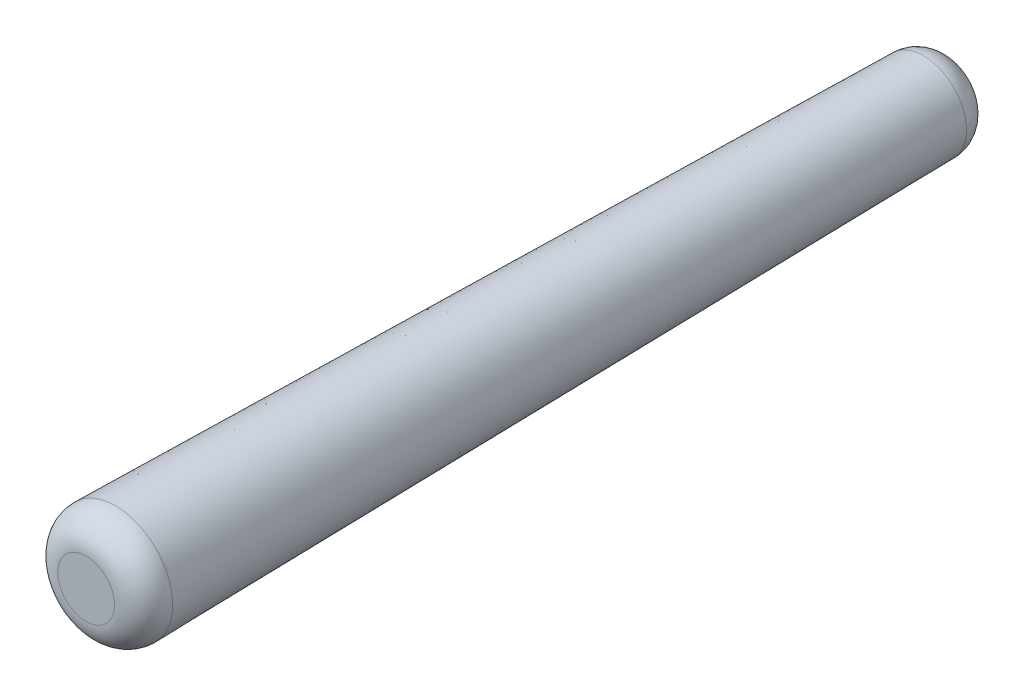
ISO-10303-21;
HEADER;
FILE_DESCRIPTION(('STEP AP214'),'2;1');
FILE_NAME('part.step','',(''),(''),'','','');
FILE_SCHEMA(('AUTOMOTIVE_DESIGN { 1 0 10303 214 1 1 1 1 }'));
ENDSEC;
DATA;
#1=APPLICATION_CONTEXT('core data for automotive mechanical design processes');
#2=APPLICATION_PROTOCOL_DEFINITION('international standard','automotive_design',2000,#1);
#3=PRODUCT_CONTEXT('',#1,'mechanical');
#4=PRODUCT('Part','Part','',(#3));
#5=PRODUCT_RELATED_PRODUCT_CATEGORY('part','',(#4));
#6=PRODUCT_DEFINITION_FORMATION('','',#4);
#7=PRODUCT_DEFINITION_CONTEXT('part definition',#1,'design');
#8=PRODUCT_DEFINITION('design','',#6,#7);
#9=PRODUCT_DEFINITION_SHAPE('','',#8);
#10=(LENGTH_UNIT() NAMED_UNIT(*) SI_UNIT(.MILLI.,.METRE.));
#11=(NAMED_UNIT(*) PLANE_ANGLE_UNIT() SI_UNIT($,.RADIAN.));
#12=(NAMED_UNIT(*) SI_UNIT($,.STERADIAN.) SOLID_ANGLE_UNIT());
#13=UNCERTAINTY_MEASURE_WITH_UNIT(LENGTH_MEASURE(1.E-05),#10,'distance_accuracy_value','');
#14=(GEOMETRIC_REPRESENTATION_CONTEXT(3) GLOBAL_UNCERTAINTY_ASSIGNED_CONTEXT((#13)) GLOBAL_UNIT_ASSIGNED_CONTEXT((#10,
#11,#12)) REPRESENTATION_CONTEXT('',''));
#15=CARTESIAN_POINT('',(0.,0.,0.));
#16=DIRECTION('',(0.,0.,1.));
#17=DIRECTION('',(1.,0.,0.));
#18=AXIS2_PLACEMENT_3D('',#15,#16,#17);
#19=CARTESIAN_POINT('',(0.,0.,0.));
#20=DIRECTION('',(0.,0.,1.00000000000001));
#21=DIRECTION('',(1.00000000000001,0.,0.));
#22=AXIS2_PLACEMENT_3D('',#19,#20,#21);
#23=CONICAL_SURFACE('',#22,2.,0.0174532925199433);
#24=CARTESIAN_POINT('',(-1.66533453693773E-13,-1.66533453693773E-13,-29.0174524064387));
#25=DIRECTION('',(0.,0.,1.00000000000001));
#26=DIRECTION('',(1.00000000000001,0.,0.));
#27=AXIS2_PLACEMENT_3D('',#24,#25,#26);
#28=CIRCLE('',#27,1.49349848419417);
#29=CARTESIAN_POINT('',(1.49349848419402,-1.6839645811064E-13,-29.0174524064387));
#30=VERTEX_POINT('',#29);
#31=EDGE_CURVE('E50',#30,#30,#28,.T.);
#32=ORIENTED_EDGE('',*,*,#31,.T.);
#33=EDGE_LOOP('',(#32));
#34=FACE_BOUND('',#33,.T.);
#35=CARTESIAN_POINT('',(-1.11022302462516E-13,1.11022302462516E-13,-1.01745240643736));
#36=DIRECTION('',(0.,0.,-1.00000000000001));
#37=DIRECTION('',(-1.00000000000001,0.,0.));
#38=AXIS2_PLACEMENT_3D('',#35,#36,#37);
#39=CIRCLE('',#38,1.98224030218427);
#40=CARTESIAN_POINT('',(-1.98224030218439,1.13494968138003E-13,-1.01745240643736));
#41=VERTEX_POINT('',#40);
#42=EDGE_CURVE('E56',#41,#41,#39,.T.);
#43=ORIENTED_EDGE('',*,*,#42,.T.);
#44=EDGE_LOOP('',(#43));
#45=FACE_BOUND('',#44,.T.);
#46=ADVANCED_FACE('F36',(#34,#45),#23,.T.);
#47=CARTESIAN_POINT('',(0.,0.,-30.0000000000015));
#48=DIRECTION('',(0.,0.,1.00000000000001));
#49=DIRECTION('',(1.00000000000001,0.,0.));
#50=AXIS2_PLACEMENT_3D('',#47,#48,#49);
#51=PLANE('',#50);
#52=CARTESIAN_POINT('',(0.,0.,-30.0000000000015));
#53=DIRECTION('',(0.,0.,1.00000000000001));
#54=DIRECTION('',(1.00000000000001,0.,0.));
#55=AXIS2_PLACEMENT_3D('',#52,#53,#54);
#56=CIRCLE('',#55,0.493650789037781);
#57=CARTESIAN_POINT('',(0.493650789037729,0.,-30.0000000000015));
#58=VERTEX_POINT('',#57);
#59=EDGE_CURVE('E44',#58,#58,#56,.F.);
#60=ORIENTED_EDGE('',*,*,#59,.T.);
#61=EDGE_LOOP('',(#60));
#62=FACE_BOUND('',#61,.T.);
#63=ADVANCED_FACE('F74',(#62),#51,.F.);
#64=CARTESIAN_POINT('',(0.,0.,0.));
#65=DIRECTION('',(0.,0.,1.00000000000001));
#66=DIRECTION('',(1.00000000000001,0.,0.));
#67=AXIS2_PLACEMENT_3D('',#64,#65,#66);
#68=PLANE('',#67);
#69=CARTESIAN_POINT('',(0.,0.,0.));
#70=DIRECTION('',(0.,0.,1.00000000000001));
#71=DIRECTION('',(1.00000000000001,0.,0.));
#72=AXIS2_PLACEMENT_3D('',#69,#70,#71);
#73=CIRCLE('',#72,0.982392607027874);
#74=CARTESIAN_POINT('',(0.982392607027882,0.,0.));
#75=VERTEX_POINT('',#74);
#76=EDGE_CURVE('E10',#75,#75,#73,.T.);
#77=ORIENTED_EDGE('',*,*,#76,.T.);
#78=EDGE_LOOP('',(#77));
#79=FACE_BOUND('',#78,.T.);
#80=ADVANCED_FACE('F71',(#79),#68,.T.);
#81=CARTESIAN_POINT('',(-1.11022302462516E-13,-1.11022302462516E-13,-29.0000000000013));
#82=DIRECTION('',(0.,0.,1.00000000000001));
#83=DIRECTION('',(1.00000000000001,0.,0.));
#84=AXIS2_PLACEMENT_3D('',#81,#82,#83);
#85=DEGENERATE_TOROIDAL_SURFACE('',#84,0.493650789037781,1.,.T.);
#86=ORIENTED_EDGE('',*,*,#59,.F.);
#87=EDGE_LOOP('',(#86));
#88=FACE_BOUND('',#87,.T.);
#89=ORIENTED_EDGE('',*,*,#31,.F.);
#90=EDGE_LOOP('',(#89));
#91=FACE_BOUND('',#90,.T.);
#92=ADVANCED_FACE('F67',(#88,#91),#85,.T.);
#93=CARTESIAN_POINT('',(-2.22044604925031E-13,0.,-0.99999999999989));
#94=DIRECTION('',(0.,0.,1.00000000000001));
#95=DIRECTION('',(1.00000000000001,0.,0.));
#96=AXIS2_PLACEMENT_3D('',#93,#94,#95);
#97=DEGENERATE_TOROIDAL_SURFACE('',#96,0.982392607027874,1.,.T.);
#98=ORIENTED_EDGE('',*,*,#42,.F.);
#99=EDGE_LOOP('',(#98));
#100=FACE_BOUND('',#99,.T.);
#101=ORIENTED_EDGE('',*,*,#76,.F.);
#102=EDGE_LOOP('',(#101));
#103=FACE_BOUND('',#102,.T.);
#104=ADVANCED_FACE('F38',(#100,#103),#97,.T.);
#105=CLOSED_SHELL('',(#46,#63,#80,#92,#104));
#106=MANIFOLD_SOLID_BREP('B2',#105);
#107=ADVANCED_BREP_SHAPE_REPRESENTATION('',(#18,#106),#14);
#108=SHAPE_DEFINITION_REPRESENTATION(#9,#107);
ENDSEC;
END-ISO-10303-21;
